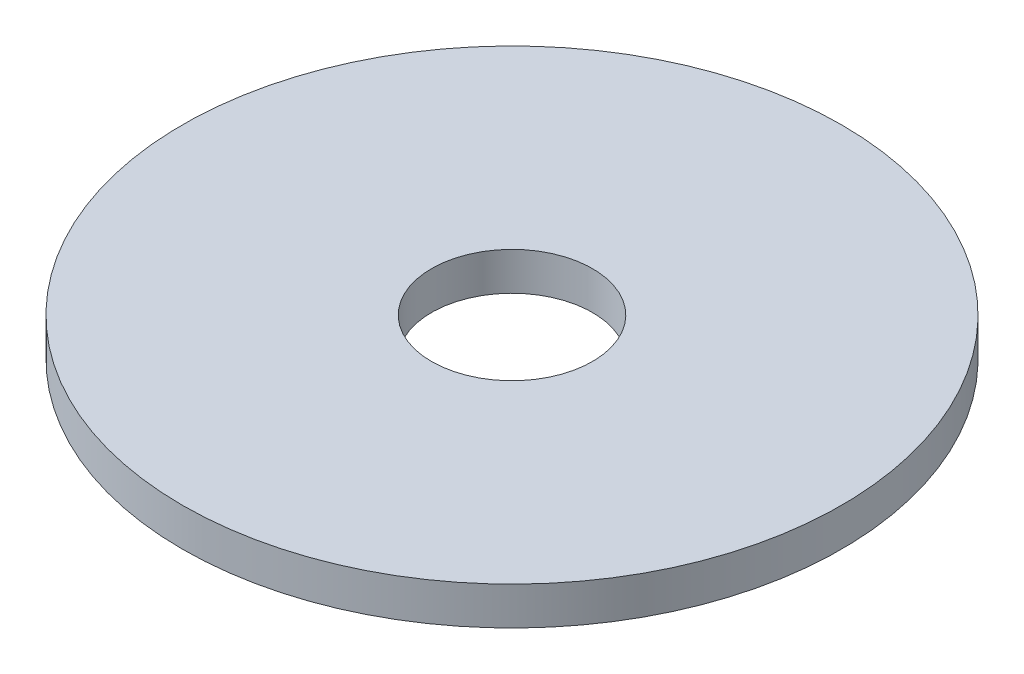
ISO-10303-21;
HEADER;
FILE_DESCRIPTION(('STEP AP214'),'2;1');
FILE_NAME('part.step','',(''),(''),'','','');
FILE_SCHEMA(('AUTOMOTIVE_DESIGN { 1 0 10303 214 1 1 1 1 }'));
ENDSEC;
DATA;
#1=APPLICATION_CONTEXT('core data for automotive mechanical design processes');
#2=APPLICATION_PROTOCOL_DEFINITION('international standard','automotive_design',2000,#1);
#3=PRODUCT_CONTEXT('',#1,'mechanical');
#4=PRODUCT('Part','Part','',(#3));
#5=PRODUCT_RELATED_PRODUCT_CATEGORY('part','',(#4));
#6=PRODUCT_DEFINITION_FORMATION('','',#4);
#7=PRODUCT_DEFINITION_CONTEXT('part definition',#1,'design');
#8=PRODUCT_DEFINITION('design','',#6,#7);
#9=PRODUCT_DEFINITION_SHAPE('','',#8);
#10=(LENGTH_UNIT() NAMED_UNIT(*) SI_UNIT(.MILLI.,.METRE.));
#11=(NAMED_UNIT(*) PLANE_ANGLE_UNIT() SI_UNIT($,.RADIAN.));
#12=(NAMED_UNIT(*) SI_UNIT($,.STERADIAN.) SOLID_ANGLE_UNIT());
#13=UNCERTAINTY_MEASURE_WITH_UNIT(LENGTH_MEASURE(1.E-05),#10,'distance_accuracy_value','');
#14=(GEOMETRIC_REPRESENTATION_CONTEXT(3) GLOBAL_UNCERTAINTY_ASSIGNED_CONTEXT((#13)) GLOBAL_UNIT_ASSIGNED_CONTEXT((#10,
#11,#12)) REPRESENTATION_CONTEXT('',''));
#15=CARTESIAN_POINT('',(0.,0.,0.));
#16=DIRECTION('',(0.,0.,1.));
#17=DIRECTION('',(1.,0.,0.));
#18=AXIS2_PLACEMENT_3D('',#15,#16,#17);
#19=CARTESIAN_POINT('',(0.,3.,0.));
#20=DIRECTION('',(0.,1.,0.));
#21=DIRECTION('',(0.,0.,1.));
#22=AXIS2_PLACEMENT_3D('',#19,#20,#21);
#23=PLANE('',#22);
#24=CARTESIAN_POINT('',(0.,3.,0.));
#25=DIRECTION('',(0.,1.,0.));
#26=DIRECTION('',(0.,0.,1.));
#27=AXIS2_PLACEMENT_3D('',#24,#25,#26);
#28=CIRCLE('',#27,26.);
#29=CARTESIAN_POINT('',(0.,3.,26.));
#30=VERTEX_POINT('',#29);
#31=EDGE_CURVE('E10',#30,#30,#28,.T.);
#32=ORIENTED_EDGE('',*,*,#31,.T.);
#33=EDGE_LOOP('',(#32));
#34=FACE_BOUND('',#33,.T.);
#35=CARTESIAN_POINT('',(0.,3.,0.));
#36=DIRECTION('',(0.,1.,0.));
#37=DIRECTION('',(0.,0.,1.));
#38=AXIS2_PLACEMENT_3D('',#35,#36,#37);
#39=CIRCLE('',#38,6.35);
#40=CARTESIAN_POINT('',(0.,3.,6.35));
#41=VERTEX_POINT('',#40);
#42=EDGE_CURVE('E55',#41,#41,#39,.T.);
#43=ORIENTED_EDGE('',*,*,#42,.F.);
#44=EDGE_LOOP('',(#43));
#45=FACE_BOUND('',#44,.T.);
#46=ADVANCED_FACE('F41',(#34,#45),#23,.T.);
#47=CARTESIAN_POINT('',(0.,0.,0.));
#48=DIRECTION('',(0.,1.,0.));
#49=DIRECTION('',(0.,0.,1.));
#50=AXIS2_PLACEMENT_3D('',#47,#48,#49);
#51=PLANE('',#50);
#52=CARTESIAN_POINT('',(0.,0.,0.));
#53=DIRECTION('',(0.,1.,0.));
#54=DIRECTION('',(0.,0.,1.));
#55=AXIS2_PLACEMENT_3D('',#52,#53,#54);
#56=CIRCLE('',#55,26.);
#57=CARTESIAN_POINT('',(0.,0.,26.));
#58=VERTEX_POINT('',#57);
#59=EDGE_CURVE('E45',#58,#58,#56,.T.);
#60=ORIENTED_EDGE('',*,*,#59,.F.);
#61=EDGE_LOOP('',(#60));
#62=FACE_BOUND('',#61,.T.);
#63=CARTESIAN_POINT('',(0.,0.,0.));
#64=DIRECTION('',(0.,1.,0.));
#65=DIRECTION('',(0.,0.,1.));
#66=AXIS2_PLACEMENT_3D('',#63,#64,#65);
#67=CIRCLE('',#66,6.35);
#68=CARTESIAN_POINT('',(0.,0.,6.35));
#69=VERTEX_POINT('',#68);
#70=EDGE_CURVE('E57',#69,#69,#67,.T.);
#71=ORIENTED_EDGE('',*,*,#70,.T.);
#72=EDGE_LOOP('',(#71));
#73=FACE_BOUND('',#72,.T.);
#74=ADVANCED_FACE('F68',(#62,#73),#51,.F.);
#75=CARTESIAN_POINT('',(0.,3.,0.));
#76=DIRECTION('',(0.,-1.,0.));
#77=DIRECTION('',(0.,0.,-1.));
#78=AXIS2_PLACEMENT_3D('',#75,#76,#77);
#79=CYLINDRICAL_SURFACE('',#78,26.);
#80=ORIENTED_EDGE('',*,*,#31,.F.);
#81=EDGE_LOOP('',(#80));
#82=FACE_BOUND('',#81,.T.);
#83=ORIENTED_EDGE('',*,*,#59,.T.);
#84=EDGE_LOOP('',(#83));
#85=FACE_BOUND('',#84,.T.);
#86=ADVANCED_FACE('F43',(#82,#85),#79,.T.);
#87=CARTESIAN_POINT('',(0.,3.,0.));
#88=DIRECTION('',(0.,-1.,0.));
#89=DIRECTION('',(0.,0.,-1.));
#90=AXIS2_PLACEMENT_3D('',#87,#88,#89);
#91=CYLINDRICAL_SURFACE('',#90,6.35);
#92=ORIENTED_EDGE('',*,*,#42,.T.);
#93=EDGE_LOOP('',(#92));
#94=FACE_BOUND('',#93,.T.);
#95=ORIENTED_EDGE('',*,*,#70,.F.);
#96=EDGE_LOOP('',(#95));
#97=FACE_BOUND('',#96,.T.);
#98=ADVANCED_FACE('F64',(#94,#97),#91,.F.);
#99=CLOSED_SHELL('',(#46,#74,#86,#98));
#100=MANIFOLD_SOLID_BREP('B2',#99);
#101=ADVANCED_BREP_SHAPE_REPRESENTATION('',(#18,#100),#14);
#102=SHAPE_DEFINITION_REPRESENTATION(#9,#101);
ENDSEC;
END-ISO-10303-21;
